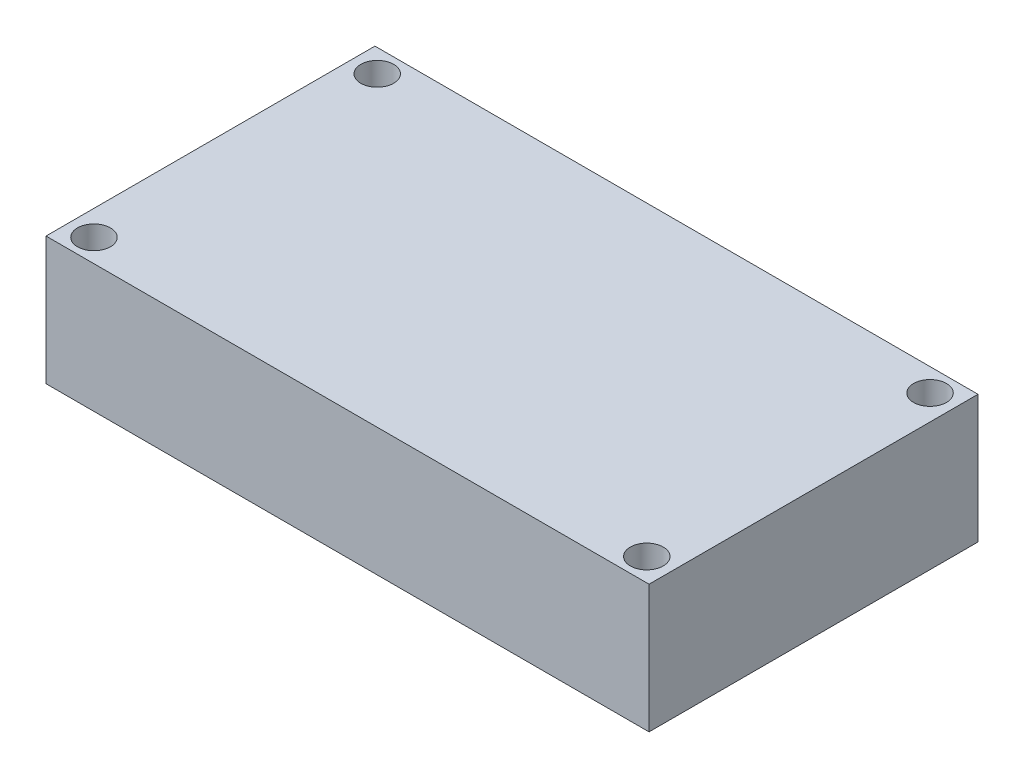
ISO-10303-21;
HEADER;
FILE_DESCRIPTION(('STEP AP214'),'2;1');
FILE_NAME('part.step','',(''),(''),'','','');
FILE_SCHEMA(('AUTOMOTIVE_DESIGN { 1 0 10303 214 1 1 1 1 }'));
ENDSEC;
DATA;
#1=APPLICATION_CONTEXT('core data for automotive mechanical design processes');
#2=APPLICATION_PROTOCOL_DEFINITION('international standard','automotive_design',2000,#1);
#3=PRODUCT_CONTEXT('',#1,'mechanical');
#4=PRODUCT('Part','Part','',(#3));
#5=PRODUCT_RELATED_PRODUCT_CATEGORY('part','',(#4));
#6=PRODUCT_DEFINITION_FORMATION('','',#4);
#7=PRODUCT_DEFINITION_CONTEXT('part definition',#1,'design');
#8=PRODUCT_DEFINITION('design','',#6,#7);
#9=PRODUCT_DEFINITION_SHAPE('','',#8);
#10=(LENGTH_UNIT() NAMED_UNIT(*) SI_UNIT(.MILLI.,.METRE.));
#11=(NAMED_UNIT(*) PLANE_ANGLE_UNIT() SI_UNIT($,.RADIAN.));
#12=(NAMED_UNIT(*) SI_UNIT($,.STERADIAN.) SOLID_ANGLE_UNIT());
#13=UNCERTAINTY_MEASURE_WITH_UNIT(LENGTH_MEASURE(1.E-05),#10,'distance_accuracy_value','');
#14=(GEOMETRIC_REPRESENTATION_CONTEXT(3) GLOBAL_UNCERTAINTY_ASSIGNED_CONTEXT((#13)) GLOBAL_UNIT_ASSIGNED_CONTEXT((#10,
#11,#12)) REPRESENTATION_CONTEXT('',''));
#15=CARTESIAN_POINT('',(0.,0.,0.));
#16=DIRECTION('',(0.,0.,1.));
#17=DIRECTION('',(1.,0.,0.));
#18=AXIS2_PLACEMENT_3D('',#15,#16,#17);
#19=CARTESIAN_POINT('',(0.,0.,0.));
#20=DIRECTION('',(0.,-1.,0.));
#21=DIRECTION('',(0.,0.,-1.));
#22=AXIS2_PLACEMENT_3D('',#19,#20,#21);
#23=PLANE('',#22);
#24=DIRECTION('',(0.,0.,1.));
#25=VECTOR('',#24,1.);
#26=CARTESIAN_POINT('',(0.,0.,0.));
#27=LINE('',#26,#25);
#28=CARTESIAN_POINT('',(0.,0.,-36.));
#29=VERTEX_POINT('',#28);
#30=CARTESIAN_POINT('',(0.,0.,0.));
#31=VERTEX_POINT('',#30);
#32=EDGE_CURVE('E108',#29,#31,#27,.T.);
#33=ORIENTED_EDGE('',*,*,#32,.F.);
#34=DIRECTION('',(-1.,0.,0.));
#35=VECTOR('',#34,1.);
#36=CARTESIAN_POINT('',(0.,0.,-36.));
#37=LINE('',#36,#35);
#38=CARTESIAN_POINT('',(66.,0.,-36.));
#39=VERTEX_POINT('',#38);
#40=EDGE_CURVE('E83',#39,#29,#37,.T.);
#41=ORIENTED_EDGE('',*,*,#40,.F.);
#42=DIRECTION('',(0.,0.,-1.));
#43=VECTOR('',#42,1.);
#44=CARTESIAN_POINT('',(66.,0.,0.));
#45=LINE('',#44,#43);
#46=CARTESIAN_POINT('',(66.,0.,0.));
#47=VERTEX_POINT('',#46);
#48=EDGE_CURVE('E77',#47,#39,#45,.T.);
#49=ORIENTED_EDGE('',*,*,#48,.F.);
#50=DIRECTION('',(1.,0.,0.));
#51=VECTOR('',#50,1.);
#52=CARTESIAN_POINT('',(0.,0.,0.));
#53=LINE('',#52,#51);
#54=EDGE_CURVE('E100',#31,#47,#53,.T.);
#55=ORIENTED_EDGE('',*,*,#54,.F.);
#56=EDGE_LOOP('',(#33,#41,#49,#55));
#57=FACE_BOUND('',#56,.T.);
#58=CARTESIAN_POINT('',(63.25,0.,-33.5));
#59=DIRECTION('',(0.,1.,0.));
#60=DIRECTION('',(0.,0.,1.));
#61=AXIS2_PLACEMENT_3D('',#58,#59,#60);
#62=CIRCLE('',#61,1.8);
#63=CARTESIAN_POINT('',(63.25,0.,-31.7));
#64=VERTEX_POINT('',#63);
#65=EDGE_CURVE('E111',#64,#64,#62,.T.);
#66=ORIENTED_EDGE('',*,*,#65,.T.);
#67=EDGE_LOOP('',(#66));
#68=FACE_BOUND('',#67,.T.);
#69=CARTESIAN_POINT('',(2.75,0.,-2.5));
#70=DIRECTION('',(0.,1.,0.));
#71=DIRECTION('',(0.,0.,1.));
#72=AXIS2_PLACEMENT_3D('',#69,#70,#71);
#73=CIRCLE('',#72,1.8);
#74=CARTESIAN_POINT('',(2.75,0.,-0.700000000000004));
#75=VERTEX_POINT('',#74);
#76=EDGE_CURVE('E127',#75,#75,#73,.T.);
#77=ORIENTED_EDGE('',*,*,#76,.T.);
#78=EDGE_LOOP('',(#77));
#79=FACE_BOUND('',#78,.T.);
#80=CARTESIAN_POINT('',(2.74999999999999,0.,-33.5));
#81=DIRECTION('',(0.,1.,0.));
#82=DIRECTION('',(0.,0.,1.));
#83=AXIS2_PLACEMENT_3D('',#80,#81,#82);
#84=CIRCLE('',#83,1.8);
#85=CARTESIAN_POINT('',(2.74999999999999,0.,-31.7));
#86=VERTEX_POINT('',#85);
#87=EDGE_CURVE('E133',#86,#86,#84,.T.);
#88=ORIENTED_EDGE('',*,*,#87,.T.);
#89=EDGE_LOOP('',(#88));
#90=FACE_BOUND('',#89,.T.);
#91=CARTESIAN_POINT('',(63.25,0.,-2.5));
#92=DIRECTION('',(0.,1.,0.));
#93=DIRECTION('',(0.,0.,1.));
#94=AXIS2_PLACEMENT_3D('',#91,#92,#93);
#95=CIRCLE('',#94,1.8);
#96=CARTESIAN_POINT('',(63.25,0.,-0.700000000000006));
#97=VERTEX_POINT('',#96);
#98=EDGE_CURVE('E139',#97,#97,#95,.T.);
#99=ORIENTED_EDGE('',*,*,#98,.T.);
#100=EDGE_LOOP('',(#99));
#101=FACE_BOUND('',#100,.T.);
#102=ADVANCED_FACE('F43',(#57,#68,#79,#90,#101),#23,.T.);
#103=CARTESIAN_POINT('',(0.,14.,0.));
#104=DIRECTION('',(0.,-1.,0.));
#105=DIRECTION('',(0.,0.,-1.));
#106=AXIS2_PLACEMENT_3D('',#103,#104,#105);
#107=PLANE('',#106);
#108=CARTESIAN_POINT('',(2.74999999999999,14.,-33.5));
#109=DIRECTION('',(0.,1.,0.));
#110=DIRECTION('',(0.,0.,1.));
#111=AXIS2_PLACEMENT_3D('',#108,#109,#110);
#112=CIRCLE('',#111,1.79999999999999);
#113=CARTESIAN_POINT('',(2.74999999999999,14.,-31.7));
#114=VERTEX_POINT('',#113);
#115=EDGE_CURVE('E136',#114,#114,#112,.T.);
#116=ORIENTED_EDGE('',*,*,#115,.F.);
#117=EDGE_LOOP('',(#116));
#118=FACE_BOUND('',#117,.T.);
#119=CARTESIAN_POINT('',(2.75,14.,-2.5));
#120=DIRECTION('',(0.,1.,0.));
#121=DIRECTION('',(0.,0.,1.));
#122=AXIS2_PLACEMENT_3D('',#119,#120,#121);
#123=CIRCLE('',#122,1.79999999999999);
#124=CARTESIAN_POINT('',(2.75,14.,-0.700000000000015));
#125=VERTEX_POINT('',#124);
#126=EDGE_CURVE('E130',#125,#125,#123,.T.);
#127=ORIENTED_EDGE('',*,*,#126,.F.);
#128=EDGE_LOOP('',(#127));
#129=FACE_BOUND('',#128,.T.);
#130=CARTESIAN_POINT('',(63.25,14.,-33.5));
#131=DIRECTION('',(0.,1.,0.));
#132=DIRECTION('',(0.,0.,1.));
#133=AXIS2_PLACEMENT_3D('',#130,#131,#132);
#134=CIRCLE('',#133,1.79999999999998);
#135=CARTESIAN_POINT('',(63.25,14.,-31.7));
#136=VERTEX_POINT('',#135);
#137=EDGE_CURVE('E124',#136,#136,#134,.T.);
#138=ORIENTED_EDGE('',*,*,#137,.F.);
#139=EDGE_LOOP('',(#138));
#140=FACE_BOUND('',#139,.T.);
#141=DIRECTION('',(0.,0.,1.));
#142=VECTOR('',#141,1.);
#143=CARTESIAN_POINT('',(0.,14.,0.));
#144=LINE('',#143,#142);
#145=CARTESIAN_POINT('',(0.,14.,-36.));
#146=VERTEX_POINT('',#145);
#147=CARTESIAN_POINT('',(0.,14.,0.));
#148=VERTEX_POINT('',#147);
#149=EDGE_CURVE('E96',#146,#148,#144,.T.);
#150=ORIENTED_EDGE('',*,*,#149,.T.);
#151=DIRECTION('',(1.,0.,0.));
#152=VECTOR('',#151,1.);
#153=CARTESIAN_POINT('',(0.,14.,0.));
#154=LINE('',#153,#152);
#155=CARTESIAN_POINT('',(66.,14.,0.));
#156=VERTEX_POINT('',#155);
#157=EDGE_CURVE('E90',#148,#156,#154,.T.);
#158=ORIENTED_EDGE('',*,*,#157,.T.);
#159=DIRECTION('',(0.,0.,-1.));
#160=VECTOR('',#159,1.);
#161=CARTESIAN_POINT('',(66.,14.,0.));
#162=LINE('',#161,#160);
#163=CARTESIAN_POINT('',(66.,14.,-36.));
#164=VERTEX_POINT('',#163);
#165=EDGE_CURVE('E94',#156,#164,#162,.T.);
#166=ORIENTED_EDGE('',*,*,#165,.T.);
#167=DIRECTION('',(-1.,0.,0.));
#168=VECTOR('',#167,1.);
#169=CARTESIAN_POINT('',(0.,14.,-36.));
#170=LINE('',#169,#168);
#171=EDGE_CURVE('E60',#164,#146,#170,.T.);
#172=ORIENTED_EDGE('',*,*,#171,.T.);
#173=EDGE_LOOP('',(#150,#158,#166,#172));
#174=FACE_BOUND('',#173,.T.);
#175=CARTESIAN_POINT('',(63.25,14.,-2.5));
#176=DIRECTION('',(0.,1.,0.));
#177=DIRECTION('',(0.,0.,1.));
#178=AXIS2_PLACEMENT_3D('',#175,#176,#177);
#179=CIRCLE('',#178,1.79999999999998);
#180=CARTESIAN_POINT('',(63.25,14.,-0.70000000000002));
#181=VERTEX_POINT('',#180);
#182=EDGE_CURVE('E142',#181,#181,#179,.T.);
#183=ORIENTED_EDGE('',*,*,#182,.F.);
#184=EDGE_LOOP('',(#183));
#185=FACE_BOUND('',#184,.T.);
#186=ADVANCED_FACE('F91',(#118,#129,#140,#174,#185),#107,.F.);
#187=CARTESIAN_POINT('',(0.,14.,0.));
#188=DIRECTION('',(1.,0.,0.));
#189=DIRECTION('',(0.,0.,-1.));
#190=AXIS2_PLACEMENT_3D('',#187,#188,#189);
#191=PLANE('',#190);
#192=ORIENTED_EDGE('',*,*,#32,.T.);
#193=DIRECTION('',(0.,-1.,0.));
#194=VECTOR('',#193,1.);
#195=CARTESIAN_POINT('',(0.,14.,0.));
#196=LINE('',#195,#194);
#197=EDGE_CURVE('E11',#148,#31,#196,.T.);
#198=ORIENTED_EDGE('',*,*,#197,.F.);
#199=ORIENTED_EDGE('',*,*,#149,.F.);
#200=DIRECTION('',(0.,-1.,0.));
#201=VECTOR('',#200,1.);
#202=CARTESIAN_POINT('',(0.,14.,-36.));
#203=LINE('',#202,#201);
#204=EDGE_CURVE('E104',#146,#29,#203,.T.);
#205=ORIENTED_EDGE('',*,*,#204,.T.);
#206=EDGE_LOOP('',(#192,#198,#199,#205));
#207=FACE_BOUND('',#206,.T.);
#208=ADVANCED_FACE('F45',(#207),#191,.F.);
#209=CARTESIAN_POINT('',(0.,14.,0.));
#210=DIRECTION('',(0.,0.,-1.));
#211=DIRECTION('',(-1.,0.,0.));
#212=AXIS2_PLACEMENT_3D('',#209,#210,#211);
#213=PLANE('',#212);
#214=ORIENTED_EDGE('',*,*,#54,.T.);
#215=DIRECTION('',(0.,-1.,0.));
#216=VECTOR('',#215,1.);
#217=CARTESIAN_POINT('',(66.,14.,0.));
#218=LINE('',#217,#216);
#219=EDGE_CURVE('E52',#156,#47,#218,.T.);
#220=ORIENTED_EDGE('',*,*,#219,.F.);
#221=ORIENTED_EDGE('',*,*,#157,.F.);
#222=ORIENTED_EDGE('',*,*,#197,.T.);
#223=EDGE_LOOP('',(#214,#220,#221,#222));
#224=FACE_BOUND('',#223,.T.);
#225=ADVANCED_FACE('F99',(#224),#213,.F.);
#226=CARTESIAN_POINT('',(66.,14.,0.));
#227=DIRECTION('',(-1.,0.,0.));
#228=DIRECTION('',(0.,0.,1.));
#229=AXIS2_PLACEMENT_3D('',#226,#227,#228);
#230=PLANE('',#229);
#231=ORIENTED_EDGE('',*,*,#48,.T.);
#232=DIRECTION('',(0.,-1.,0.));
#233=VECTOR('',#232,1.);
#234=CARTESIAN_POINT('',(66.,14.,-36.));
#235=LINE('',#234,#233);
#236=EDGE_CURVE('E101',#164,#39,#235,.T.);
#237=ORIENTED_EDGE('',*,*,#236,.F.);
#238=ORIENTED_EDGE('',*,*,#165,.F.);
#239=ORIENTED_EDGE('',*,*,#219,.T.);
#240=EDGE_LOOP('',(#231,#237,#238,#239));
#241=FACE_BOUND('',#240,.T.);
#242=ADVANCED_FACE('F102',(#241),#230,.F.);
#243=CARTESIAN_POINT('',(0.,14.,-36.));
#244=DIRECTION('',(0.,0.,1.));
#245=DIRECTION('',(1.,0.,0.));
#246=AXIS2_PLACEMENT_3D('',#243,#244,#245);
#247=PLANE('',#246);
#248=ORIENTED_EDGE('',*,*,#40,.T.);
#249=ORIENTED_EDGE('',*,*,#204,.F.);
#250=ORIENTED_EDGE('',*,*,#171,.F.);
#251=ORIENTED_EDGE('',*,*,#236,.T.);
#252=EDGE_LOOP('',(#248,#249,#250,#251));
#253=FACE_BOUND('',#252,.T.);
#254=ADVANCED_FACE('F116',(#253),#247,.F.);
#255=CARTESIAN_POINT('',(63.25,14.,-33.5));
#256=DIRECTION('',(0.,1.,0.));
#257=DIRECTION('',(0.,0.,1.));
#258=AXIS2_PLACEMENT_3D('',#255,#256,#257);
#259=CYLINDRICAL_SURFACE('',#258,1.79999999999999);
#260=ORIENTED_EDGE('',*,*,#65,.F.);
#261=EDGE_LOOP('',(#260));
#262=FACE_BOUND('',#261,.T.);
#263=ORIENTED_EDGE('',*,*,#137,.T.);
#264=EDGE_LOOP('',(#263));
#265=FACE_BOUND('',#264,.T.);
#266=ADVANCED_FACE('F159',(#262,#265),#259,.F.);
#267=CARTESIAN_POINT('',(2.75,14.,-2.5));
#268=DIRECTION('',(0.,1.,0.));
#269=DIRECTION('',(0.,0.,1.));
#270=AXIS2_PLACEMENT_3D('',#267,#268,#269);
#271=CYLINDRICAL_SURFACE('',#270,1.79999999999999);
#272=ORIENTED_EDGE('',*,*,#76,.F.);
#273=EDGE_LOOP('',(#272));
#274=FACE_BOUND('',#273,.T.);
#275=ORIENTED_EDGE('',*,*,#126,.T.);
#276=EDGE_LOOP('',(#275));
#277=FACE_BOUND('',#276,.T.);
#278=ADVANCED_FACE('F195',(#274,#277),#271,.F.);
#279=CARTESIAN_POINT('',(2.74999999999999,14.,-33.5));
#280=DIRECTION('',(0.,1.,0.));
#281=DIRECTION('',(0.,0.,1.));
#282=AXIS2_PLACEMENT_3D('',#279,#280,#281);
#283=CYLINDRICAL_SURFACE('',#282,1.79999999999999);
#284=ORIENTED_EDGE('',*,*,#87,.F.);
#285=EDGE_LOOP('',(#284));
#286=FACE_BOUND('',#285,.T.);
#287=ORIENTED_EDGE('',*,*,#115,.T.);
#288=EDGE_LOOP('',(#287));
#289=FACE_BOUND('',#288,.T.);
#290=ADVANCED_FACE('F203',(#286,#289),#283,.F.);
#291=CARTESIAN_POINT('',(63.25,14.,-2.5));
#292=DIRECTION('',(0.,1.,0.));
#293=DIRECTION('',(0.,0.,1.));
#294=AXIS2_PLACEMENT_3D('',#291,#292,#293);
#295=CYLINDRICAL_SURFACE('',#294,1.79999999999999);
#296=ORIENTED_EDGE('',*,*,#98,.F.);
#297=EDGE_LOOP('',(#296));
#298=FACE_BOUND('',#297,.T.);
#299=ORIENTED_EDGE('',*,*,#182,.T.);
#300=EDGE_LOOP('',(#299));
#301=FACE_BOUND('',#300,.T.);
#302=ADVANCED_FACE('F146',(#298,#301),#295,.F.);
#303=CLOSED_SHELL('',(#102,#186,#208,#225,#242,#254,#266,#278,#290,#302));
#304=MANIFOLD_SOLID_BREP('B2',#303);
#305=ADVANCED_BREP_SHAPE_REPRESENTATION('',(#18,#304),#14);
#306=SHAPE_DEFINITION_REPRESENTATION(#9,#305);
ENDSEC;
END-ISO-10303-21;
